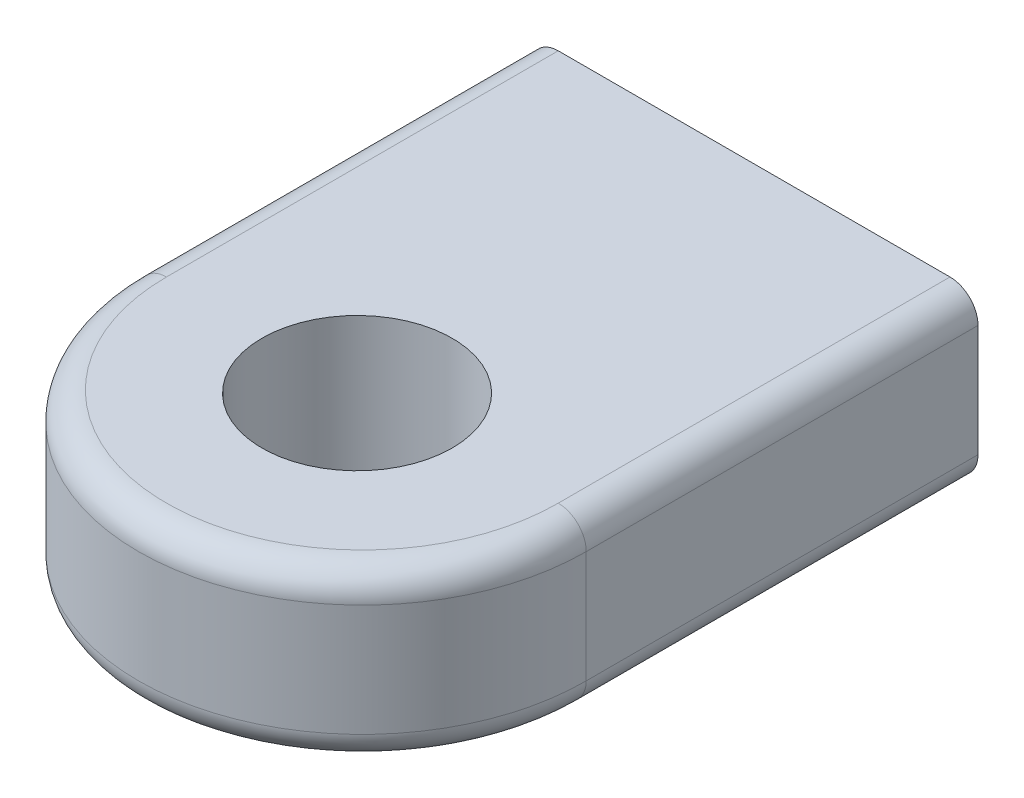
ISO-10303-21;
HEADER;
FILE_DESCRIPTION(('STEP AP214'),'2;1');
FILE_NAME('part.step','',(''),(''),'','','');
FILE_SCHEMA(('AUTOMOTIVE_DESIGN { 1 0 10303 214 1 1 1 1 }'));
ENDSEC;
DATA;
#1=APPLICATION_CONTEXT('core data for automotive mechanical design processes');
#2=APPLICATION_PROTOCOL_DEFINITION('international standard','automotive_design',2000,#1);
#3=PRODUCT_CONTEXT('',#1,'mechanical');
#4=PRODUCT('Part','Part','',(#3));
#5=PRODUCT_RELATED_PRODUCT_CATEGORY('part','',(#4));
#6=PRODUCT_DEFINITION_FORMATION('','',#4);
#7=PRODUCT_DEFINITION_CONTEXT('part definition',#1,'design');
#8=PRODUCT_DEFINITION('design','',#6,#7);
#9=PRODUCT_DEFINITION_SHAPE('','',#8);
#10=(LENGTH_UNIT() NAMED_UNIT(*) SI_UNIT(.MILLI.,.METRE.));
#11=(NAMED_UNIT(*) PLANE_ANGLE_UNIT() SI_UNIT($,.RADIAN.));
#12=(NAMED_UNIT(*) SI_UNIT($,.STERADIAN.) SOLID_ANGLE_UNIT());
#13=UNCERTAINTY_MEASURE_WITH_UNIT(LENGTH_MEASURE(1.E-05),#10,'distance_accuracy_value','');
#14=(GEOMETRIC_REPRESENTATION_CONTEXT(3) GLOBAL_UNCERTAINTY_ASSIGNED_CONTEXT((#13)) GLOBAL_UNIT_ASSIGNED_CONTEXT((#10,
#11,#12)) REPRESENTATION_CONTEXT('',''));
#15=CARTESIAN_POINT('',(0.,0.,0.));
#16=DIRECTION('',(0.,0.,1.));
#17=DIRECTION('',(1.,0.,0.));
#18=AXIS2_PLACEMENT_3D('',#15,#16,#17);
#19=CARTESIAN_POINT('',(0.,30.,70.));
#20=DIRECTION('',(0.,1.,0.));
#21=DIRECTION('',(-1.,0.,0.));
#22=AXIS2_PLACEMENT_3D('',#19,#20,#21);
#23=CYLINDRICAL_SURFACE('',#22,40.);
#24=DIRECTION('',(0.,1.,0.));
#25=VECTOR('',#24,1.);
#26=CARTESIAN_POINT('',(-40.,30.,70.));
#27=LINE('',#26,#25);
#28=CARTESIAN_POINT('',(-40.,4.99999999999999,70.));
#29=VERTEX_POINT('',#28);
#30=CARTESIAN_POINT('',(-40.,25.,70.));
#31=VERTEX_POINT('',#30);
#32=EDGE_CURVE('E113',#29,#31,#27,.T.);
#33=ORIENTED_EDGE('',*,*,#32,.F.);
#34=CARTESIAN_POINT('',(0.,5.,70.));
#35=DIRECTION('',(0.,1.,0.));
#36=DIRECTION('',(-1.,0.,0.));
#37=AXIS2_PLACEMENT_3D('',#34,#35,#36);
#38=CIRCLE('',#37,40.);
#39=CARTESIAN_POINT('',(40.,5.00000000000001,70.));
#40=VERTEX_POINT('',#39);
#41=EDGE_CURVE('E11',#29,#40,#38,.T.);
#42=ORIENTED_EDGE('',*,*,#41,.T.);
#43=DIRECTION('',(0.,1.,0.));
#44=VECTOR('',#43,1.);
#45=CARTESIAN_POINT('',(40.,30.,70.));
#46=LINE('',#45,#44);
#47=CARTESIAN_POINT('',(40.,25.,70.));
#48=VERTEX_POINT('',#47);
#49=EDGE_CURVE('E105',#48,#40,#46,.F.);
#50=ORIENTED_EDGE('',*,*,#49,.F.);
#51=CARTESIAN_POINT('',(0.,25.,70.));
#52=DIRECTION('',(0.,-1.,0.));
#53=DIRECTION('',(1.,0.,0.));
#54=AXIS2_PLACEMENT_3D('',#51,#52,#53);
#55=CIRCLE('',#54,40.);
#56=EDGE_CURVE('E44',#48,#31,#55,.T.);
#57=ORIENTED_EDGE('',*,*,#56,.T.);
#58=EDGE_LOOP('',(#33,#42,#50,#57));
#59=FACE_BOUND('',#58,.T.);
#60=ADVANCED_FACE('F35',(#59),#23,.T.);
#61=CARTESIAN_POINT('',(40.,30.,110.));
#62=DIRECTION('',(-1.,0.,0.));
#63=DIRECTION('',(0.,-1.,0.));
#64=AXIS2_PLACEMENT_3D('',#61,#62,#63);
#65=PLANE('',#64);
#66=ORIENTED_EDGE('',*,*,#49,.T.);
#67=DIRECTION('',(0.,0.,-1.));
#68=VECTOR('',#67,1.);
#69=CARTESIAN_POINT('',(40.,5.00000000000002,110.));
#70=LINE('',#69,#68);
#71=CARTESIAN_POINT('',(40.,5.00000000000002,0.));
#72=VERTEX_POINT('',#71);
#73=EDGE_CURVE('E112',#40,#72,#70,.T.);
#74=ORIENTED_EDGE('',*,*,#73,.T.);
#75=DIRECTION('',(0.,1.,0.));
#76=VECTOR('',#75,1.);
#77=CARTESIAN_POINT('',(40.,30.,0.));
#78=LINE('',#77,#76);
#79=CARTESIAN_POINT('',(40.,25.,0.));
#80=VERTEX_POINT('',#79);
#81=EDGE_CURVE('E108',#72,#80,#78,.T.);
#82=ORIENTED_EDGE('',*,*,#81,.T.);
#83=DIRECTION('',(0.,0.,-1.));
#84=VECTOR('',#83,1.);
#85=CARTESIAN_POINT('',(40.,25.,110.));
#86=LINE('',#85,#84);
#87=EDGE_CURVE('E101',#80,#48,#86,.F.);
#88=ORIENTED_EDGE('',*,*,#87,.T.);
#89=EDGE_LOOP('',(#66,#74,#82,#88));
#90=FACE_BOUND('',#89,.T.);
#91=ADVANCED_FACE('F103',(#90),#65,.F.);
#92=CARTESIAN_POINT('',(40.,30.,110.));
#93=DIRECTION('',(0.,-1.,0.));
#94=DIRECTION('',(1.,0.,0.));
#95=AXIS2_PLACEMENT_3D('',#92,#93,#94);
#96=PLANE('',#95);
#97=CARTESIAN_POINT('',(0.,30.,70.95));
#98=DIRECTION('',(0.,-1.,0.));
#99=DIRECTION('',(1.,0.,0.));
#100=AXIS2_PLACEMENT_3D('',#97,#98,#99);
#101=CIRCLE('',#100,17.);
#102=CARTESIAN_POINT('',(17.,30.,70.95));
#103=VERTEX_POINT('',#102);
#104=EDGE_CURVE('E139',#103,#103,#101,.F.);
#105=ORIENTED_EDGE('',*,*,#104,.F.);
#106=EDGE_LOOP('',(#105));
#107=FACE_BOUND('',#106,.T.);
#108=DIRECTION('',(-1.,0.,0.));
#109=VECTOR('',#108,1.);
#110=CARTESIAN_POINT('',(40.,30.,0.));
#111=LINE('',#110,#109);
#112=CARTESIAN_POINT('',(35.,30.,0.));
#113=VERTEX_POINT('',#112);
#114=CARTESIAN_POINT('',(-35.,30.,0.));
#115=VERTEX_POINT('',#114);
#116=EDGE_CURVE('E150',#113,#115,#111,.T.);
#117=ORIENTED_EDGE('',*,*,#116,.T.);
#118=DIRECTION('',(0.,0.,-1.));
#119=VECTOR('',#118,1.);
#120=CARTESIAN_POINT('',(-35.,30.,110.));
#121=LINE('',#120,#119);
#122=CARTESIAN_POINT('',(-35.,30.,70.));
#123=VERTEX_POINT('',#122);
#124=EDGE_CURVE('E57',#115,#123,#121,.F.);
#125=ORIENTED_EDGE('',*,*,#124,.T.);
#126=CARTESIAN_POINT('',(0.,30.,70.));
#127=DIRECTION('',(0.,-1.,0.));
#128=DIRECTION('',(1.,0.,0.));
#129=AXIS2_PLACEMENT_3D('',#126,#127,#128);
#130=CIRCLE('',#129,35.);
#131=CARTESIAN_POINT('',(35.,30.,70.));
#132=VERTEX_POINT('',#131);
#133=EDGE_CURVE('E52',#123,#132,#130,.F.);
#134=ORIENTED_EDGE('',*,*,#133,.T.);
#135=DIRECTION('',(0.,0.,-1.));
#136=VECTOR('',#135,1.);
#137=CARTESIAN_POINT('',(35.,30.,110.));
#138=LINE('',#137,#136);
#139=EDGE_CURVE('E123',#132,#113,#138,.T.);
#140=ORIENTED_EDGE('',*,*,#139,.T.);
#141=EDGE_LOOP('',(#117,#125,#134,#140));
#142=FACE_BOUND('',#141,.T.);
#143=ADVANCED_FACE('F179',(#107,#142),#96,.F.);
#144=CARTESIAN_POINT('',(-40.,30.,110.));
#145=DIRECTION('',(1.,0.,0.));
#146=DIRECTION('',(0.,1.,0.));
#147=AXIS2_PLACEMENT_3D('',#144,#145,#146);
#148=PLANE('',#147);
#149=DIRECTION('',(0.,-1.,0.));
#150=VECTOR('',#149,1.);
#151=CARTESIAN_POINT('',(-40.,30.,0.));
#152=LINE('',#151,#150);
#153=CARTESIAN_POINT('',(-40.,25.,0.));
#154=VERTEX_POINT('',#153);
#155=CARTESIAN_POINT('',(-40.,4.99999999999999,0.));
#156=VERTEX_POINT('',#155);
#157=EDGE_CURVE('E152',#154,#156,#152,.T.);
#158=ORIENTED_EDGE('',*,*,#157,.T.);
#159=DIRECTION('',(0.,0.,-1.));
#160=VECTOR('',#159,1.);
#161=CARTESIAN_POINT('',(-40.,4.99999999999999,110.));
#162=LINE('',#161,#160);
#163=EDGE_CURVE('E176',#156,#29,#162,.F.);
#164=ORIENTED_EDGE('',*,*,#163,.T.);
#165=ORIENTED_EDGE('',*,*,#32,.T.);
#166=DIRECTION('',(0.,0.,-1.));
#167=VECTOR('',#166,1.);
#168=CARTESIAN_POINT('',(-40.,25.,110.));
#169=LINE('',#168,#167);
#170=EDGE_CURVE('E173',#31,#154,#169,.T.);
#171=ORIENTED_EDGE('',*,*,#170,.T.);
#172=EDGE_LOOP('',(#158,#164,#165,#171));
#173=FACE_BOUND('',#172,.T.);
#174=ADVANCED_FACE('F185',(#173),#148,.F.);
#175=CARTESIAN_POINT('',(40.,0.,110.));
#176=DIRECTION('',(0.,1.,0.));
#177=DIRECTION('',(-1.,0.,0.));
#178=AXIS2_PLACEMENT_3D('',#175,#176,#177);
#179=PLANE('',#178);
#180=CARTESIAN_POINT('',(0.,0.,70.95));
#181=DIRECTION('',(0.,-1.,0.));
#182=DIRECTION('',(1.,0.,0.));
#183=AXIS2_PLACEMENT_3D('',#180,#181,#182);
#184=CIRCLE('',#183,17.);
#185=CARTESIAN_POINT('',(17.,0.,70.95));
#186=VERTEX_POINT('',#185);
#187=EDGE_CURVE('E142',#186,#186,#184,.T.);
#188=ORIENTED_EDGE('',*,*,#187,.F.);
#189=EDGE_LOOP('',(#188));
#190=FACE_BOUND('',#189,.T.);
#191=DIRECTION('',(1.,0.,0.));
#192=VECTOR('',#191,1.);
#193=CARTESIAN_POINT('',(40.,0.,0.));
#194=LINE('',#193,#192);
#195=CARTESIAN_POINT('',(-35.,0.,0.));
#196=VERTEX_POINT('',#195);
#197=CARTESIAN_POINT('',(35.,0.,0.));
#198=VERTEX_POINT('',#197);
#199=EDGE_CURVE('E120',#196,#198,#194,.T.);
#200=ORIENTED_EDGE('',*,*,#199,.T.);
#201=DIRECTION('',(0.,0.,-1.));
#202=VECTOR('',#201,1.);
#203=CARTESIAN_POINT('',(35.,0.,110.));
#204=LINE('',#203,#202);
#205=CARTESIAN_POINT('',(35.,0.,70.));
#206=VERTEX_POINT('',#205);
#207=EDGE_CURVE('E171',#198,#206,#204,.F.);
#208=ORIENTED_EDGE('',*,*,#207,.T.);
#209=CARTESIAN_POINT('',(0.,0.,70.));
#210=DIRECTION('',(0.,1.,0.));
#211=DIRECTION('',(-1.,0.,0.));
#212=AXIS2_PLACEMENT_3D('',#209,#210,#211);
#213=CIRCLE('',#212,35.);
#214=CARTESIAN_POINT('',(-35.,0.,70.));
#215=VERTEX_POINT('',#214);
#216=EDGE_CURVE('E167',#206,#215,#213,.F.);
#217=ORIENTED_EDGE('',*,*,#216,.T.);
#218=DIRECTION('',(0.,0.,-1.));
#219=VECTOR('',#218,1.);
#220=CARTESIAN_POINT('',(-35.,0.,110.));
#221=LINE('',#220,#219);
#222=EDGE_CURVE('E169',#215,#196,#221,.T.);
#223=ORIENTED_EDGE('',*,*,#222,.T.);
#224=EDGE_LOOP('',(#200,#208,#217,#223));
#225=FACE_BOUND('',#224,.T.);
#226=ADVANCED_FACE('F201',(#190,#225),#179,.F.);
#227=CARTESIAN_POINT('',(0.,0.,0.));
#228=DIRECTION('',(0.,0.,-1.));
#229=DIRECTION('',(-1.,0.,0.));
#230=AXIS2_PLACEMENT_3D('',#227,#228,#229);
#231=PLANE('',#230);
#232=ORIENTED_EDGE('',*,*,#81,.F.);
#233=CARTESIAN_POINT('',(35.,5.00000000000002,0.));
#234=DIRECTION('',(0.,0.,-1.));
#235=DIRECTION('',(-1.,0.,0.));
#236=AXIS2_PLACEMENT_3D('',#233,#234,#235);
#237=CIRCLE('',#236,5.);
#238=EDGE_CURVE('E165',#72,#198,#237,.T.);
#239=ORIENTED_EDGE('',*,*,#238,.T.);
#240=ORIENTED_EDGE('',*,*,#199,.F.);
#241=CARTESIAN_POINT('',(-35.,4.99999999999999,0.));
#242=DIRECTION('',(0.,0.,-1.));
#243=DIRECTION('',(-1.,0.,0.));
#244=AXIS2_PLACEMENT_3D('',#241,#242,#243);
#245=CIRCLE('',#244,5.);
#246=EDGE_CURVE('E163',#196,#156,#245,.T.);
#247=ORIENTED_EDGE('',*,*,#246,.T.);
#248=ORIENTED_EDGE('',*,*,#157,.F.);
#249=CARTESIAN_POINT('',(-35.,25.,0.));
#250=DIRECTION('',(0.,0.,-1.));
#251=DIRECTION('',(-1.,0.,0.));
#252=AXIS2_PLACEMENT_3D('',#249,#250,#251);
#253=CIRCLE('',#252,5.);
#254=EDGE_CURVE('E161',#154,#115,#253,.T.);
#255=ORIENTED_EDGE('',*,*,#254,.T.);
#256=ORIENTED_EDGE('',*,*,#116,.F.);
#257=CARTESIAN_POINT('',(35.,25.,0.));
#258=DIRECTION('',(0.,0.,-1.));
#259=DIRECTION('',(-1.,0.,0.));
#260=AXIS2_PLACEMENT_3D('',#257,#258,#259);
#261=CIRCLE('',#260,5.);
#262=EDGE_CURVE('E159',#113,#80,#261,.T.);
#263=ORIENTED_EDGE('',*,*,#262,.T.);
#264=EDGE_LOOP('',(#232,#239,#240,#247,#248,#255,#256,#263));
#265=FACE_BOUND('',#264,.T.);
#266=ADVANCED_FACE('F181',(#265),#231,.T.);
#267=CARTESIAN_POINT('',(-35.,4.99999999999999,110.));
#268=DIRECTION('',(0.,0.,-1.));
#269=DIRECTION('',(-1.,0.,0.));
#270=AXIS2_PLACEMENT_3D('',#267,#268,#269);
#271=CYLINDRICAL_SURFACE('',#270,5.);
#272=ORIENTED_EDGE('',*,*,#246,.F.);
#273=ORIENTED_EDGE('',*,*,#222,.F.);
#274=CARTESIAN_POINT('',(-35.,4.99999999999999,70.));
#275=DIRECTION('',(0.,0.,1.));
#276=DIRECTION('',(1.,0.,0.));
#277=AXIS2_PLACEMENT_3D('',#274,#275,#276);
#278=CIRCLE('',#277,5.);
#279=EDGE_CURVE('E137',#29,#215,#278,.T.);
#280=ORIENTED_EDGE('',*,*,#279,.F.);
#281=ORIENTED_EDGE('',*,*,#163,.F.);
#282=EDGE_LOOP('',(#272,#273,#280,#281));
#283=FACE_BOUND('',#282,.T.);
#284=ADVANCED_FACE('F191',(#283),#271,.T.);
#285=CARTESIAN_POINT('',(0.,5.,70.));
#286=DIRECTION('',(0.,1.,0.));
#287=DIRECTION('',(-1.,0.,0.));
#288=AXIS2_PLACEMENT_3D('',#285,#286,#287);
#289=TOROIDAL_SURFACE('',#288,35.,5.);
#290=ORIENTED_EDGE('',*,*,#279,.T.);
#291=ORIENTED_EDGE('',*,*,#216,.F.);
#292=CARTESIAN_POINT('',(35.,5.00000000000001,70.));
#293=DIRECTION('',(0.,0.,-1.));
#294=DIRECTION('',(-1.,0.,0.));
#295=AXIS2_PLACEMENT_3D('',#292,#293,#294);
#296=CIRCLE('',#295,5.);
#297=EDGE_CURVE('E125',#40,#206,#296,.T.);
#298=ORIENTED_EDGE('',*,*,#297,.F.);
#299=ORIENTED_EDGE('',*,*,#41,.F.);
#300=EDGE_LOOP('',(#290,#291,#298,#299));
#301=FACE_BOUND('',#300,.T.);
#302=ADVANCED_FACE('F194',(#301),#289,.T.);
#303=CARTESIAN_POINT('',(35.,5.00000000000002,110.));
#304=DIRECTION('',(0.,0.,-1.));
#305=DIRECTION('',(-1.,0.,0.));
#306=AXIS2_PLACEMENT_3D('',#303,#304,#305);
#307=CYLINDRICAL_SURFACE('',#306,5.);
#308=ORIENTED_EDGE('',*,*,#297,.T.);
#309=ORIENTED_EDGE('',*,*,#207,.F.);
#310=ORIENTED_EDGE('',*,*,#238,.F.);
#311=ORIENTED_EDGE('',*,*,#73,.F.);
#312=EDGE_LOOP('',(#308,#309,#310,#311));
#313=FACE_BOUND('',#312,.T.);
#314=ADVANCED_FACE('F198',(#313),#307,.T.);
#315=CARTESIAN_POINT('',(35.,25.,110.));
#316=DIRECTION('',(0.,0.,-1.));
#317=DIRECTION('',(-1.,0.,0.));
#318=AXIS2_PLACEMENT_3D('',#315,#316,#317);
#319=CYLINDRICAL_SURFACE('',#318,5.);
#320=ORIENTED_EDGE('',*,*,#262,.F.);
#321=ORIENTED_EDGE('',*,*,#139,.F.);
#322=CARTESIAN_POINT('',(35.,25.,70.));
#323=DIRECTION('',(0.,0.,1.));
#324=DIRECTION('',(1.,0.,0.));
#325=AXIS2_PLACEMENT_3D('',#322,#323,#324);
#326=CIRCLE('',#325,5.);
#327=EDGE_CURVE('E39',#48,#132,#326,.T.);
#328=ORIENTED_EDGE('',*,*,#327,.F.);
#329=ORIENTED_EDGE('',*,*,#87,.F.);
#330=EDGE_LOOP('',(#320,#321,#328,#329));
#331=FACE_BOUND('',#330,.T.);
#332=ADVANCED_FACE('F37',(#331),#319,.T.);
#333=CARTESIAN_POINT('',(0.,25.,70.));
#334=DIRECTION('',(0.,-1.,0.));
#335=DIRECTION('',(1.,0.,0.));
#336=AXIS2_PLACEMENT_3D('',#333,#334,#335);
#337=TOROIDAL_SURFACE('',#336,35.,5.);
#338=ORIENTED_EDGE('',*,*,#327,.T.);
#339=ORIENTED_EDGE('',*,*,#133,.F.);
#340=CARTESIAN_POINT('',(-35.,25.,70.));
#341=DIRECTION('',(0.,0.,-1.));
#342=DIRECTION('',(-1.,0.,0.));
#343=AXIS2_PLACEMENT_3D('',#340,#341,#342);
#344=CIRCLE('',#343,5.);
#345=EDGE_CURVE('E126',#31,#123,#344,.T.);
#346=ORIENTED_EDGE('',*,*,#345,.F.);
#347=ORIENTED_EDGE('',*,*,#56,.F.);
#348=EDGE_LOOP('',(#338,#339,#346,#347));
#349=FACE_BOUND('',#348,.T.);
#350=ADVANCED_FACE('F128',(#349),#337,.T.);
#351=CARTESIAN_POINT('',(-35.,25.,110.));
#352=DIRECTION('',(0.,0.,-1.));
#353=DIRECTION('',(-1.,0.,0.));
#354=AXIS2_PLACEMENT_3D('',#351,#352,#353);
#355=CYLINDRICAL_SURFACE('',#354,5.);
#356=ORIENTED_EDGE('',*,*,#345,.T.);
#357=ORIENTED_EDGE('',*,*,#124,.F.);
#358=ORIENTED_EDGE('',*,*,#254,.F.);
#359=ORIENTED_EDGE('',*,*,#170,.F.);
#360=EDGE_LOOP('',(#356,#357,#358,#359));
#361=FACE_BOUND('',#360,.T.);
#362=ADVANCED_FACE('F183',(#361),#355,.T.);
#363=CARTESIAN_POINT('',(0.,30.001,70.95));
#364=DIRECTION('',(0.,-1.,0.));
#365=DIRECTION('',(1.,0.,0.));
#366=AXIS2_PLACEMENT_3D('',#363,#364,#365);
#367=CYLINDRICAL_SURFACE('',#366,17.);
#368=ORIENTED_EDGE('',*,*,#187,.T.);
#369=EDGE_LOOP('',(#368));
#370=FACE_BOUND('',#369,.T.);
#371=ORIENTED_EDGE('',*,*,#104,.T.);
#372=EDGE_LOOP('',(#371));
#373=FACE_BOUND('',#372,.T.);
#374=ADVANCED_FACE('F230',(#370,#373),#367,.F.);
#375=CLOSED_SHELL('',(#60,#91,#143,#174,#226,#266,#284,#302,#314,#332,#350,#362,#374));
#376=MANIFOLD_SOLID_BREP('B2',#375);
#377=ADVANCED_BREP_SHAPE_REPRESENTATION('',(#18,#376),#14);
#378=SHAPE_DEFINITION_REPRESENTATION(#9,#377);
ENDSEC;
END-ISO-10303-21;
